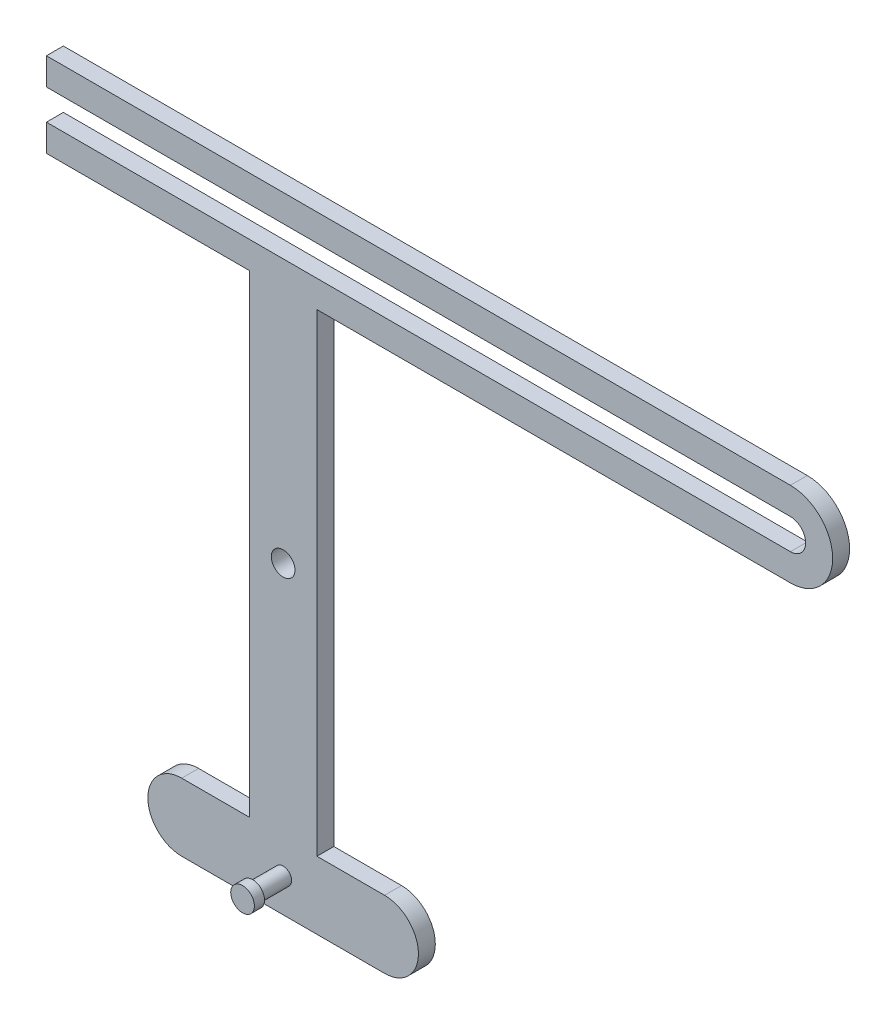
ISO-10303-21;
HEADER;
FILE_DESCRIPTION(('STEP AP214'),'2;1');
FILE_NAME('part.step','',(''),(''),'','','');
FILE_SCHEMA(('AUTOMOTIVE_DESIGN { 1 0 10303 214 1 1 1 1 }'));
ENDSEC;
DATA;
#1=APPLICATION_CONTEXT('core data for automotive mechanical design processes');
#2=APPLICATION_PROTOCOL_DEFINITION('international standard','automotive_design',2000,#1);
#3=PRODUCT_CONTEXT('',#1,'mechanical');
#4=PRODUCT('Part','Part','',(#3));
#5=PRODUCT_RELATED_PRODUCT_CATEGORY('part','',(#4));
#6=PRODUCT_DEFINITION_FORMATION('','',#4);
#7=PRODUCT_DEFINITION_CONTEXT('part definition',#1,'design');
#8=PRODUCT_DEFINITION('design','',#6,#7);
#9=PRODUCT_DEFINITION_SHAPE('','',#8);
#10=(LENGTH_UNIT() NAMED_UNIT(*) SI_UNIT(.MILLI.,.METRE.));
#11=(NAMED_UNIT(*) PLANE_ANGLE_UNIT() SI_UNIT($,.RADIAN.));
#12=(NAMED_UNIT(*) SI_UNIT($,.STERADIAN.) SOLID_ANGLE_UNIT());
#13=UNCERTAINTY_MEASURE_WITH_UNIT(LENGTH_MEASURE(1.E-05),#10,'distance_accuracy_value','');
#14=(GEOMETRIC_REPRESENTATION_CONTEXT(3) GLOBAL_UNCERTAINTY_ASSIGNED_CONTEXT((#13)) GLOBAL_UNIT_ASSIGNED_CONTEXT((#10,
#11,#12)) REPRESENTATION_CONTEXT('',''));
#15=CARTESIAN_POINT('',(0.,0.,0.));
#16=DIRECTION('',(0.,0.,1.));
#17=DIRECTION('',(1.,0.,0.));
#18=AXIS2_PLACEMENT_3D('',#15,#16,#17);
#19=CARTESIAN_POINT('',(0.,0.,18.415));
#20=DIRECTION('',(0.,0.,-1.));
#21=DIRECTION('',(-1.,0.,0.));
#22=AXIS2_PLACEMENT_3D('',#19,#20,#21);
#23=CYLINDRICAL_SURFACE('',#22,3.175);
#24=CARTESIAN_POINT('',(0.,0.,3.175));
#25=DIRECTION('',(0.,0.,1.));
#26=DIRECTION('',(1.,0.,0.));
#27=AXIS2_PLACEMENT_3D('',#24,#25,#26);
#28=CIRCLE('',#27,3.175);
#29=CARTESIAN_POINT('',(-3.175,0.,3.175));
#30=VERTEX_POINT('',#29);
#31=EDGE_CURVE('E379',#30,#30,#28,.T.);
#32=CARTESIAN_POINT('',(0.,0.,14.605));
#33=DIRECTION('',(0.,0.,1.));
#34=DIRECTION('',(1.,0.,0.));
#35=AXIS2_PLACEMENT_3D('',#32,#33,#34);
#36=CIRCLE('',#35,3.175);
#37=CARTESIAN_POINT('',(-3.175,0.,14.605));
#38=VERTEX_POINT('',#37);
#39=EDGE_CURVE('E11',#38,#38,#36,.T.);
#40=CARTESIAN_POINT('',(-3.175,0.,3.175));
#41=CARTESIAN_POINT('',(-3.175,0.,3.2940625));
#42=CARTESIAN_POINT('',(-3.175,0.,3.413125));
#43=CARTESIAN_POINT('',(-3.175,0.,3.65125));
#44=CARTESIAN_POINT('',(-3.175,0.,3.7703125));
#45=CARTESIAN_POINT('',(-3.175,0.,4.0084375));
#46=CARTESIAN_POINT('',(-3.175,0.,4.1275));
#47=CARTESIAN_POINT('',(-3.175,0.,4.365625));
#48=CARTESIAN_POINT('',(-3.175,0.,4.4846875));
#49=CARTESIAN_POINT('',(-3.175,0.,4.7228125));
#50=CARTESIAN_POINT('',(-3.175,0.,4.841875));
#51=CARTESIAN_POINT('',(-3.175,0.,5.08));
#52=CARTESIAN_POINT('',(-3.175,0.,5.1990625));
#53=CARTESIAN_POINT('',(-3.175,0.,5.4371875));
#54=CARTESIAN_POINT('',(-3.175,0.,5.55625));
#55=CARTESIAN_POINT('',(-3.175,0.,5.794375));
#56=CARTESIAN_POINT('',(-3.175,0.,5.9134375));
#57=CARTESIAN_POINT('',(-3.175,0.,6.1515625));
#58=CARTESIAN_POINT('',(-3.175,0.,6.270625));
#59=CARTESIAN_POINT('',(-3.175,0.,6.50875));
#60=CARTESIAN_POINT('',(-3.175,0.,6.6278125));
#61=CARTESIAN_POINT('',(-3.175,0.,6.8659375));
#62=CARTESIAN_POINT('',(-3.175,0.,6.985));
#63=CARTESIAN_POINT('',(-3.175,0.,7.223125));
#64=CARTESIAN_POINT('',(-3.175,0.,7.3421875));
#65=CARTESIAN_POINT('',(-3.175,0.,7.5803125));
#66=CARTESIAN_POINT('',(-3.175,0.,7.699375));
#67=CARTESIAN_POINT('',(-3.175,0.,7.9375));
#68=CARTESIAN_POINT('',(-3.175,0.,8.0565625));
#69=CARTESIAN_POINT('',(-3.175,0.,8.2946875));
#70=CARTESIAN_POINT('',(-3.175,0.,8.41375));
#71=CARTESIAN_POINT('',(-3.175,0.,8.651875));
#72=CARTESIAN_POINT('',(-3.175,0.,8.7709375));
#73=CARTESIAN_POINT('',(-3.175,0.,9.0090625));
#74=CARTESIAN_POINT('',(-3.175,0.,9.128125));
#75=CARTESIAN_POINT('',(-3.175,0.,9.36625));
#76=CARTESIAN_POINT('',(-3.175,0.,9.4853125));
#77=CARTESIAN_POINT('',(-3.175,0.,9.7234375));
#78=CARTESIAN_POINT('',(-3.175,0.,9.8425));
#79=CARTESIAN_POINT('',(-3.175,0.,10.080625));
#80=CARTESIAN_POINT('',(-3.175,0.,10.1996875));
#81=CARTESIAN_POINT('',(-3.175,0.,10.4378125));
#82=CARTESIAN_POINT('',(-3.175,0.,10.556875));
#83=CARTESIAN_POINT('',(-3.175,0.,10.795));
#84=CARTESIAN_POINT('',(-3.175,0.,10.9140625));
#85=CARTESIAN_POINT('',(-3.175,0.,11.1521875));
#86=CARTESIAN_POINT('',(-3.175,0.,11.27125));
#87=CARTESIAN_POINT('',(-3.175,0.,11.509375));
#88=CARTESIAN_POINT('',(-3.175,0.,11.6284375));
#89=CARTESIAN_POINT('',(-3.175,0.,11.8665625));
#90=CARTESIAN_POINT('',(-3.175,0.,11.985625));
#91=CARTESIAN_POINT('',(-3.175,0.,12.22375));
#92=CARTESIAN_POINT('',(-3.175,0.,12.3428125));
#93=CARTESIAN_POINT('',(-3.175,0.,12.5809375));
#94=CARTESIAN_POINT('',(-3.175,0.,12.7));
#95=CARTESIAN_POINT('',(-3.175,0.,12.938125));
#96=CARTESIAN_POINT('',(-3.175,0.,13.0571875));
#97=CARTESIAN_POINT('',(-3.175,0.,13.2953125));
#98=CARTESIAN_POINT('',(-3.175,0.,13.414375));
#99=CARTESIAN_POINT('',(-3.175,0.,13.6525));
#100=CARTESIAN_POINT('',(-3.175,0.,13.7715625));
#101=CARTESIAN_POINT('',(-3.175,0.,14.0096875));
#102=CARTESIAN_POINT('',(-3.175,0.,14.12875));
#103=CARTESIAN_POINT('',(-3.175,0.,14.366875));
#104=CARTESIAN_POINT('',(-3.175,0.,14.4859375));
#105=CARTESIAN_POINT('',(-3.175,0.,14.605));
#106=B_SPLINE_CURVE_WITH_KNOTS('',3,(#40,#41,#42,#43,#44,#45,#46,#47,#48,#49,#50,#51,#52,#53,
#54,#55,#56,#57,#58,#59,#60,#61,#62,#63,#64,#65,#66,#67,#68,#69,#70,#71,#72,#73,#74,#75,#76,#77,
#78,#79,#80,#81,#82,#83,#84,#85,#86,#87,#88,#89,#90,#91,#92,#93,#94,#95,#96,#97,#98,#99,#100,
#101,#102,#103,#104,#105),.UNSPECIFIED.,.F.,.F.,(4,2,2,2,2,2,2,2,2,2,2,2,2,2,2,2,2,2,2,2,2,2,2,
2,2,2,2,2,2,2,2,2,4),(0.,0.3571875,0.714375,1.0715625,1.42875,1.7859375,2.143125,2.5003125,
2.8575,3.2146875,3.571875,3.9290625,4.28625,4.6434375,5.000625,5.3578125,5.715,6.0721875,
6.429375,6.7865625,7.14375,7.5009375,7.858125,8.2153125,8.5725,8.9296875,9.286875,9.6440625,
10.00125,10.3584375,10.715625,11.0728125,11.43),.UNSPECIFIED.);
#107=EDGE_CURVE('BSEAM34',#30,#38,#106,.T.);
#108=ORIENTED_EDGE('',*,*,#31,.T.);
#109=ORIENTED_EDGE('',*,*,#39,.F.);
#110=ORIENTED_EDGE('',*,*,#107,.T.);
#111=ORIENTED_EDGE('',*,*,#107,.F.);
#112=EDGE_LOOP('',(#108,#110,#109,#111));
#113=FACE_BOUND('',#112,.T.);
#114=ADVANCED_FACE('F34',(#113),#23,.T.);
#115=CARTESIAN_POINT('',(-38.1,0.,3.175));
#116=DIRECTION('',(0.,0.,1.));
#117=DIRECTION('',(1.,0.,0.));
#118=AXIS2_PLACEMENT_3D('',#115,#116,#117);
#119=PLANE('',#118);
#120=DIRECTION('',(1.,0.,0.));
#121=VECTOR('',#120,1.);
#122=CARTESIAN_POINT('',(-88.9,200.66,3.175));
#123=LINE('',#122,#121);
#124=CARTESIAN_POINT('',(-88.9,200.66,3.175));
#125=VERTEX_POINT('',#124);
#126=CARTESIAN_POINT('',(190.5,200.66,3.175));
#127=VERTEX_POINT('',#126);
#128=EDGE_CURVE('E154',#125,#127,#123,.T.);
#129=ORIENTED_EDGE('',*,*,#128,.F.);
#130=DIRECTION('',(0.,-1.,0.));
#131=VECTOR('',#130,1.);
#132=CARTESIAN_POINT('',(-88.9,222.25,3.175));
#133=LINE('',#132,#131);
#134=CARTESIAN_POINT('',(-88.9,190.5,3.175));
#135=VERTEX_POINT('',#134);
#136=EDGE_CURVE('E192',#125,#135,#133,.T.);
#137=ORIENTED_EDGE('',*,*,#136,.T.);
#138=DIRECTION('',(1.,0.,0.));
#139=VECTOR('',#138,1.);
#140=CARTESIAN_POINT('',(-88.9,190.5,3.175));
#141=LINE('',#140,#139);
#142=CARTESIAN_POINT('',(-12.7,190.5,3.175));
#143=VERTEX_POINT('',#142);
#144=EDGE_CURVE('E193',#135,#143,#141,.T.);
#145=ORIENTED_EDGE('',*,*,#144,.T.);
#146=DIRECTION('',(0.,-1.,0.));
#147=VECTOR('',#146,1.);
#148=CARTESIAN_POINT('',(-12.7,12.7,3.175));
#149=LINE('',#148,#147);
#150=CARTESIAN_POINT('',(-12.7,12.7,3.175));
#151=VERTEX_POINT('',#150);
#152=EDGE_CURVE('E226',#143,#151,#149,.T.);
#153=ORIENTED_EDGE('',*,*,#152,.T.);
#154=DIRECTION('',(-1.,0.,0.));
#155=VECTOR('',#154,1.);
#156=CARTESIAN_POINT('',(-38.1,12.7,3.175));
#157=LINE('',#156,#155);
#158=CARTESIAN_POINT('',(-38.1,12.7,3.175));
#159=VERTEX_POINT('',#158);
#160=EDGE_CURVE('E57',#151,#159,#157,.T.);
#161=ORIENTED_EDGE('',*,*,#160,.T.);
#162=CARTESIAN_POINT('',(-38.1,0.,3.175));
#163=DIRECTION('',(0.,0.,1.));
#164=DIRECTION('',(1.,0.,0.));
#165=AXIS2_PLACEMENT_3D('',#162,#163,#164);
#166=CIRCLE('',#165,12.7);
#167=CARTESIAN_POINT('',(-38.1,-12.7,3.175));
#168=VERTEX_POINT('',#167);
#169=EDGE_CURVE('E244',#159,#168,#166,.T.);
#170=ORIENTED_EDGE('',*,*,#169,.T.);
#171=DIRECTION('',(1.,0.,0.));
#172=VECTOR('',#171,1.);
#173=CARTESIAN_POINT('',(-38.1,-12.7,3.175));
#174=LINE('',#173,#172);
#175=CARTESIAN_POINT('',(38.1,-12.7,3.175));
#176=VERTEX_POINT('',#175);
#177=EDGE_CURVE('E247',#168,#176,#174,.T.);
#178=ORIENTED_EDGE('',*,*,#177,.T.);
#179=CARTESIAN_POINT('',(38.1,0.,3.175));
#180=DIRECTION('',(0.,0.,1.));
#181=DIRECTION('',(1.,0.,0.));
#182=AXIS2_PLACEMENT_3D('',#179,#180,#181);
#183=CIRCLE('',#182,12.7);
#184=CARTESIAN_POINT('',(38.1,12.7,3.175));
#185=VERTEX_POINT('',#184);
#186=EDGE_CURVE('E250',#176,#185,#183,.T.);
#187=ORIENTED_EDGE('',*,*,#186,.T.);
#188=CARTESIAN_POINT('',(12.7,12.7,3.175));
#189=VERTEX_POINT('',#188);
#190=EDGE_CURVE('E252',#185,#189,#157,.T.);
#191=ORIENTED_EDGE('',*,*,#190,.T.);
#192=DIRECTION('',(0.,1.,0.));
#193=VECTOR('',#192,1.);
#194=CARTESIAN_POINT('',(12.7,12.7,3.175));
#195=LINE('',#194,#193);
#196=CARTESIAN_POINT('',(12.7,190.5,3.175));
#197=VERTEX_POINT('',#196);
#198=EDGE_CURVE('E223',#189,#197,#195,.T.);
#199=ORIENTED_EDGE('',*,*,#198,.T.);
#200=CARTESIAN_POINT('',(190.5,190.5,3.175));
#201=VERTEX_POINT('',#200);
#202=EDGE_CURVE('E191',#197,#201,#141,.T.);
#203=ORIENTED_EDGE('',*,*,#202,.T.);
#204=CARTESIAN_POINT('',(190.5,206.375,3.175));
#205=DIRECTION('',(0.,0.,1.));
#206=DIRECTION('',(1.,0.,0.));
#207=AXIS2_PLACEMENT_3D('',#204,#205,#206);
#208=CIRCLE('',#207,15.875);
#209=CARTESIAN_POINT('',(190.5,222.25,3.175));
#210=VERTEX_POINT('',#209);
#211=EDGE_CURVE('E196',#201,#210,#208,.T.);
#212=ORIENTED_EDGE('',*,*,#211,.T.);
#213=DIRECTION('',(-1.,0.,0.));
#214=VECTOR('',#213,1.);
#215=CARTESIAN_POINT('',(-88.9,222.25,3.175));
#216=LINE('',#215,#214);
#217=CARTESIAN_POINT('',(-88.9,222.25,3.175));
#218=VERTEX_POINT('',#217);
#219=EDGE_CURVE('E198',#210,#218,#216,.T.);
#220=ORIENTED_EDGE('',*,*,#219,.T.);
#221=CARTESIAN_POINT('',(-88.9,212.09,3.175));
#222=VERTEX_POINT('',#221);
#223=EDGE_CURVE('E188',#218,#222,#133,.T.);
#224=ORIENTED_EDGE('',*,*,#223,.T.);
#225=DIRECTION('',(-1.,0.,0.));
#226=VECTOR('',#225,1.);
#227=CARTESIAN_POINT('',(190.5,212.09,3.175));
#228=LINE('',#227,#226);
#229=CARTESIAN_POINT('',(190.5,212.09,3.175));
#230=VERTEX_POINT('',#229);
#231=EDGE_CURVE('E49',#230,#222,#228,.T.);
#232=ORIENTED_EDGE('',*,*,#231,.F.);
#233=CARTESIAN_POINT('',(190.5,206.375,3.175));
#234=DIRECTION('',(0.,0.,1.));
#235=DIRECTION('',(1.,0.,0.));
#236=AXIS2_PLACEMENT_3D('',#233,#234,#235);
#237=CIRCLE('',#236,5.71500000000004);
#238=EDGE_CURVE('E173',#127,#230,#237,.T.);
#239=ORIENTED_EDGE('',*,*,#238,.F.);
#240=EDGE_LOOP('',(#129,#137,#145,#153,#161,#170,#178,#187,#191,#199,#203,#212,#220,#224,#232,#239));
#241=FACE_BOUND('',#240,.T.);
#242=CARTESIAN_POINT('',(0.,101.6,3.175));
#243=DIRECTION('',(0.,0.,1.));
#244=DIRECTION('',(1.,0.,0.));
#245=AXIS2_PLACEMENT_3D('',#242,#243,#244);
#246=CIRCLE('',#245,4.445);
#247=CARTESIAN_POINT('',(4.445,101.6,3.175));
#248=VERTEX_POINT('',#247);
#249=EDGE_CURVE('E176',#248,#248,#246,.T.);
#250=ORIENTED_EDGE('',*,*,#249,.F.);
#251=EDGE_LOOP('',(#250));
#252=FACE_BOUND('',#251,.T.);
#253=ORIENTED_EDGE('',*,*,#31,.F.);
#254=EDGE_LOOP('',(#253));
#255=FACE_BOUND('',#254,.T.);
#256=ADVANCED_FACE('F292',(#241,#252,#255),#119,.T.);
#257=CARTESIAN_POINT('',(-88.9,222.25,3.175));
#258=DIRECTION('',(1.,0.,0.));
#259=DIRECTION('',(0.,0.,-1.));
#260=AXIS2_PLACEMENT_3D('',#257,#258,#259);
#261=PLANE('',#260);
#262=ORIENTED_EDGE('',*,*,#136,.F.);
#263=DIRECTION('',(0.,0.,1.));
#264=VECTOR('',#263,1.);
#265=CARTESIAN_POINT('',(-88.9,200.66,-3.175));
#266=LINE('',#265,#264);
#267=CARTESIAN_POINT('',(-88.9,200.66,-3.175));
#268=VERTEX_POINT('',#267);
#269=EDGE_CURVE('E183',#268,#125,#266,.T.);
#270=ORIENTED_EDGE('',*,*,#269,.F.);
#271=DIRECTION('',(0.,-1.,0.));
#272=VECTOR('',#271,1.);
#273=CARTESIAN_POINT('',(-88.9,222.25,-3.175));
#274=LINE('',#273,#272);
#275=CARTESIAN_POINT('',(-88.9,190.5,-3.175));
#276=VERTEX_POINT('',#275);
#277=EDGE_CURVE('E171',#268,#276,#274,.T.);
#278=ORIENTED_EDGE('',*,*,#277,.T.);
#279=DIRECTION('',(0.,0.,-1.));
#280=VECTOR('',#279,1.);
#281=CARTESIAN_POINT('',(-88.9,190.5,3.175));
#282=LINE('',#281,#280);
#283=EDGE_CURVE('E219',#135,#276,#282,.T.);
#284=ORIENTED_EDGE('',*,*,#283,.F.);
#285=EDGE_LOOP('',(#262,#270,#278,#284));
#286=FACE_BOUND('',#285,.T.);
#287=ADVANCED_FACE('F320',(#286),#261,.F.);
#288=CARTESIAN_POINT('',(-38.1,12.7,3.175));
#289=DIRECTION('',(0.,-1.,0.));
#290=DIRECTION('',(1.,0.,0.));
#291=AXIS2_PLACEMENT_3D('',#288,#289,#290);
#292=PLANE('',#291);
#293=DIRECTION('',(0.,0.,-1.));
#294=VECTOR('',#293,1.);
#295=CARTESIAN_POINT('',(12.7,12.7,3.175));
#296=LINE('',#295,#294);
#297=CARTESIAN_POINT('',(12.7,12.7,-3.175));
#298=VERTEX_POINT('',#297);
#299=EDGE_CURVE('E229',#189,#298,#296,.T.);
#300=ORIENTED_EDGE('',*,*,#299,.F.);
#301=ORIENTED_EDGE('',*,*,#190,.F.);
#302=DIRECTION('',(0.,0.,-1.));
#303=VECTOR('',#302,1.);
#304=CARTESIAN_POINT('',(38.1,12.7,3.175));
#305=LINE('',#304,#303);
#306=CARTESIAN_POINT('',(38.1,12.7,-3.175));
#307=VERTEX_POINT('',#306);
#308=EDGE_CURVE('E266',#185,#307,#305,.T.);
#309=ORIENTED_EDGE('',*,*,#308,.T.);
#310=DIRECTION('',(-1.,0.,0.));
#311=VECTOR('',#310,1.);
#312=CARTESIAN_POINT('',(-38.1,12.7,-3.175));
#313=LINE('',#312,#311);
#314=EDGE_CURVE('E248',#307,#298,#313,.T.);
#315=ORIENTED_EDGE('',*,*,#314,.T.);
#316=EDGE_LOOP('',(#300,#301,#309,#315));
#317=FACE_BOUND('',#316,.T.);
#318=ADVANCED_FACE('F289',(#317),#292,.F.);
#319=DIRECTION('',(0.,0.,-1.));
#320=VECTOR('',#319,1.);
#321=CARTESIAN_POINT('',(-12.7,12.7,3.175));
#322=LINE('',#321,#320);
#323=CARTESIAN_POINT('',(-12.7,12.7,-3.175));
#324=VERTEX_POINT('',#323);
#325=EDGE_CURVE('E236',#151,#324,#322,.T.);
#326=ORIENTED_EDGE('',*,*,#325,.T.);
#327=CARTESIAN_POINT('',(-38.1,12.7,-3.175));
#328=VERTEX_POINT('',#327);
#329=EDGE_CURVE('E262',#324,#328,#313,.T.);
#330=ORIENTED_EDGE('',*,*,#329,.T.);
#331=DIRECTION('',(0.,0.,-1.));
#332=VECTOR('',#331,1.);
#333=CARTESIAN_POINT('',(-38.1,12.7,3.175));
#334=LINE('',#333,#332);
#335=EDGE_CURVE('E255',#159,#328,#334,.T.);
#336=ORIENTED_EDGE('',*,*,#335,.F.);
#337=ORIENTED_EDGE('',*,*,#160,.F.);
#338=EDGE_LOOP('',(#326,#330,#336,#337));
#339=FACE_BOUND('',#338,.T.);
#340=ADVANCED_FACE('F327',(#339),#292,.F.);
#341=CARTESIAN_POINT('',(-38.1,0.,3.175));
#342=DIRECTION('',(0.,0.,-1.));
#343=DIRECTION('',(-1.,0.,0.));
#344=AXIS2_PLACEMENT_3D('',#341,#342,#343);
#345=CYLINDRICAL_SURFACE('',#344,12.7);
#346=CARTESIAN_POINT('',(-38.1,0.,-3.175));
#347=DIRECTION('',(0.,0.,1.));
#348=DIRECTION('',(1.,0.,0.));
#349=AXIS2_PLACEMENT_3D('',#346,#347,#348);
#350=CIRCLE('',#349,12.7);
#351=CARTESIAN_POINT('',(-38.1,-12.7,-3.175));
#352=VERTEX_POINT('',#351);
#353=EDGE_CURVE('E243',#328,#352,#350,.T.);
#354=ORIENTED_EDGE('',*,*,#353,.T.);
#355=DIRECTION('',(0.,0.,-1.));
#356=VECTOR('',#355,1.);
#357=CARTESIAN_POINT('',(-38.1,-12.7,3.175));
#358=LINE('',#357,#356);
#359=EDGE_CURVE('E42',#168,#352,#358,.T.);
#360=ORIENTED_EDGE('',*,*,#359,.F.);
#361=ORIENTED_EDGE('',*,*,#169,.F.);
#362=ORIENTED_EDGE('',*,*,#335,.T.);
#363=EDGE_LOOP('',(#354,#360,#361,#362));
#364=FACE_BOUND('',#363,.T.);
#365=ADVANCED_FACE('F36',(#364),#345,.T.);
#366=CARTESIAN_POINT('',(-38.1,-12.7,3.175));
#367=DIRECTION('',(0.,1.,0.));
#368=DIRECTION('',(-1.,0.,0.));
#369=AXIS2_PLACEMENT_3D('',#366,#367,#368);
#370=PLANE('',#369);
#371=DIRECTION('',(1.,0.,0.));
#372=VECTOR('',#371,1.);
#373=CARTESIAN_POINT('',(-38.1,-12.7,-3.175));
#374=LINE('',#373,#372);
#375=CARTESIAN_POINT('',(38.1,-12.7,-3.175));
#376=VERTEX_POINT('',#375);
#377=EDGE_CURVE('E258',#352,#376,#374,.T.);
#378=ORIENTED_EDGE('',*,*,#377,.T.);
#379=DIRECTION('',(0.,0.,-1.));
#380=VECTOR('',#379,1.);
#381=CARTESIAN_POINT('',(38.1,-12.7,3.175));
#382=LINE('',#381,#380);
#383=EDGE_CURVE('E269',#176,#376,#382,.T.);
#384=ORIENTED_EDGE('',*,*,#383,.F.);
#385=ORIENTED_EDGE('',*,*,#177,.F.);
#386=ORIENTED_EDGE('',*,*,#359,.T.);
#387=EDGE_LOOP('',(#378,#384,#385,#386));
#388=FACE_BOUND('',#387,.T.);
#389=ADVANCED_FACE('F274',(#388),#370,.F.);
#390=CARTESIAN_POINT('',(38.1,0.,3.175));
#391=DIRECTION('',(0.,0.,-1.));
#392=DIRECTION('',(-1.,0.,0.));
#393=AXIS2_PLACEMENT_3D('',#390,#391,#392);
#394=CYLINDRICAL_SURFACE('',#393,12.7);
#395=CARTESIAN_POINT('',(38.1,0.,-3.175));
#396=DIRECTION('',(0.,0.,1.));
#397=DIRECTION('',(1.,0.,0.));
#398=AXIS2_PLACEMENT_3D('',#395,#396,#397);
#399=CIRCLE('',#398,12.7);
#400=EDGE_CURVE('E260',#376,#307,#399,.T.);
#401=ORIENTED_EDGE('',*,*,#400,.T.);
#402=ORIENTED_EDGE('',*,*,#308,.F.);
#403=ORIENTED_EDGE('',*,*,#186,.F.);
#404=ORIENTED_EDGE('',*,*,#383,.T.);
#405=EDGE_LOOP('',(#401,#402,#403,#404));
#406=FACE_BOUND('',#405,.T.);
#407=ADVANCED_FACE('F285',(#406),#394,.T.);
#408=CARTESIAN_POINT('',(-38.1,0.,-3.175));
#409=DIRECTION('',(0.,0.,1.));
#410=DIRECTION('',(1.,0.,0.));
#411=AXIS2_PLACEMENT_3D('',#408,#409,#410);
#412=PLANE('',#411);
#413=CARTESIAN_POINT('',(0.,101.6,-3.175));
#414=DIRECTION('',(0.,0.,1.));
#415=DIRECTION('',(1.,0.,0.));
#416=AXIS2_PLACEMENT_3D('',#413,#414,#415);
#417=CIRCLE('',#416,4.445);
#418=CARTESIAN_POINT('',(4.445,101.6,-3.175));
#419=VERTEX_POINT('',#418);
#420=EDGE_CURVE('E181',#419,#419,#417,.T.);
#421=ORIENTED_EDGE('',*,*,#420,.T.);
#422=EDGE_LOOP('',(#421));
#423=FACE_BOUND('',#422,.T.);
#424=ORIENTED_EDGE('',*,*,#277,.F.);
#425=DIRECTION('',(1.,0.,0.));
#426=VECTOR('',#425,1.);
#427=CARTESIAN_POINT('',(-88.9,200.66,-3.175));
#428=LINE('',#427,#426);
#429=CARTESIAN_POINT('',(190.5,200.66,-3.175));
#430=VERTEX_POINT('',#429);
#431=EDGE_CURVE('E151',#268,#430,#428,.T.);
#432=ORIENTED_EDGE('',*,*,#431,.T.);
#433=CARTESIAN_POINT('',(190.5,206.375,-3.175));
#434=DIRECTION('',(0.,0.,1.));
#435=DIRECTION('',(1.,0.,0.));
#436=AXIS2_PLACEMENT_3D('',#433,#434,#435);
#437=CIRCLE('',#436,5.71500000000004);
#438=CARTESIAN_POINT('',(190.5,212.09,-3.175));
#439=VERTEX_POINT('',#438);
#440=EDGE_CURVE('E162',#430,#439,#437,.T.);
#441=ORIENTED_EDGE('',*,*,#440,.T.);
#442=DIRECTION('',(-1.,0.,0.));
#443=VECTOR('',#442,1.);
#444=CARTESIAN_POINT('',(190.5,212.09,-3.175));
#445=LINE('',#444,#443);
#446=CARTESIAN_POINT('',(-88.9,212.09,-3.175));
#447=VERTEX_POINT('',#446);
#448=EDGE_CURVE('E159',#439,#447,#445,.T.);
#449=ORIENTED_EDGE('',*,*,#448,.T.);
#450=CARTESIAN_POINT('',(-88.9,222.25,-3.175));
#451=VERTEX_POINT('',#450);
#452=EDGE_CURVE('E201',#451,#447,#274,.T.);
#453=ORIENTED_EDGE('',*,*,#452,.F.);
#454=DIRECTION('',(-1.,0.,0.));
#455=VECTOR('',#454,1.);
#456=CARTESIAN_POINT('',(-88.9,222.25,-3.175));
#457=LINE('',#456,#455);
#458=CARTESIAN_POINT('',(190.5,222.25,-3.175));
#459=VERTEX_POINT('',#458);
#460=EDGE_CURVE('E209',#459,#451,#457,.T.);
#461=ORIENTED_EDGE('',*,*,#460,.F.);
#462=CARTESIAN_POINT('',(190.5,206.375,-3.175));
#463=DIRECTION('',(0.,0.,1.));
#464=DIRECTION('',(1.,0.,0.));
#465=AXIS2_PLACEMENT_3D('',#462,#463,#464);
#466=CIRCLE('',#465,15.875);
#467=CARTESIAN_POINT('',(190.5,190.5,-3.175));
#468=VERTEX_POINT('',#467);
#469=EDGE_CURVE('E207',#468,#459,#466,.T.);
#470=ORIENTED_EDGE('',*,*,#469,.F.);
#471=DIRECTION('',(1.,0.,0.));
#472=VECTOR('',#471,1.);
#473=CARTESIAN_POINT('',(-88.9,190.5,-3.175));
#474=LINE('',#473,#472);
#475=CARTESIAN_POINT('',(12.7,190.5,-3.175));
#476=VERTEX_POINT('',#475);
#477=EDGE_CURVE('E204',#476,#468,#474,.T.);
#478=ORIENTED_EDGE('',*,*,#477,.F.);
#479=DIRECTION('',(0.,1.,0.));
#480=VECTOR('',#479,1.);
#481=CARTESIAN_POINT('',(12.7,12.7,-3.175));
#482=LINE('',#481,#480);
#483=EDGE_CURVE('E222',#298,#476,#482,.T.);
#484=ORIENTED_EDGE('',*,*,#483,.F.);
#485=ORIENTED_EDGE('',*,*,#314,.F.);
#486=ORIENTED_EDGE('',*,*,#400,.F.);
#487=ORIENTED_EDGE('',*,*,#377,.F.);
#488=ORIENTED_EDGE('',*,*,#353,.F.);
#489=ORIENTED_EDGE('',*,*,#329,.F.);
#490=DIRECTION('',(0.,-1.,0.));
#491=VECTOR('',#490,1.);
#492=CARTESIAN_POINT('',(-12.7,12.7,-3.175));
#493=LINE('',#492,#491);
#494=CARTESIAN_POINT('',(-12.7,190.5,-3.175));
#495=VERTEX_POINT('',#494);
#496=EDGE_CURVE('E227',#495,#324,#493,.T.);
#497=ORIENTED_EDGE('',*,*,#496,.F.);
#498=EDGE_CURVE('E205',#276,#495,#474,.T.);
#499=ORIENTED_EDGE('',*,*,#498,.F.);
#500=EDGE_LOOP('',(#424,#432,#441,#449,#453,#461,#470,#478,#484,#485,#486,#487,#488,#489,#497,#499));
#501=FACE_BOUND('',#500,.T.);
#502=ADVANCED_FACE('F169',(#423,#501),#412,.F.);
#503=CARTESIAN_POINT('',(12.7,12.7,3.175));
#504=DIRECTION('',(-1.,0.,0.));
#505=DIRECTION('',(0.,0.,1.));
#506=AXIS2_PLACEMENT_3D('',#503,#504,#505);
#507=PLANE('',#506);
#508=ORIENTED_EDGE('',*,*,#483,.T.);
#509=DIRECTION('',(0.,0.,-1.));
#510=VECTOR('',#509,1.);
#511=CARTESIAN_POINT('',(12.7,190.5,3.175));
#512=LINE('',#511,#510);
#513=EDGE_CURVE('E241',#197,#476,#512,.T.);
#514=ORIENTED_EDGE('',*,*,#513,.F.);
#515=ORIENTED_EDGE('',*,*,#198,.F.);
#516=ORIENTED_EDGE('',*,*,#299,.T.);
#517=EDGE_LOOP('',(#508,#514,#515,#516));
#518=FACE_BOUND('',#517,.T.);
#519=ADVANCED_FACE('F296',(#518),#507,.F.);
#520=CARTESIAN_POINT('',(-12.7,12.7,3.175));
#521=DIRECTION('',(1.,0.,0.));
#522=DIRECTION('',(0.,0.,-1.));
#523=AXIS2_PLACEMENT_3D('',#520,#521,#522);
#524=PLANE('',#523);
#525=ORIENTED_EDGE('',*,*,#496,.T.);
#526=ORIENTED_EDGE('',*,*,#325,.F.);
#527=ORIENTED_EDGE('',*,*,#152,.F.);
#528=DIRECTION('',(0.,0.,-1.));
#529=VECTOR('',#528,1.);
#530=CARTESIAN_POINT('',(-12.7,190.5,3.175));
#531=LINE('',#530,#529);
#532=EDGE_CURVE('E238',#143,#495,#531,.T.);
#533=ORIENTED_EDGE('',*,*,#532,.T.);
#534=EDGE_LOOP('',(#525,#526,#527,#533));
#535=FACE_BOUND('',#534,.T.);
#536=ADVANCED_FACE('F326',(#535),#524,.F.);
#537=CARTESIAN_POINT('',(-88.9,190.5,3.175));
#538=DIRECTION('',(0.,1.,0.));
#539=DIRECTION('',(-1.,0.,0.));
#540=AXIS2_PLACEMENT_3D('',#537,#538,#539);
#541=PLANE('',#540);
#542=ORIENTED_EDGE('',*,*,#202,.F.);
#543=ORIENTED_EDGE('',*,*,#513,.T.);
#544=ORIENTED_EDGE('',*,*,#477,.T.);
#545=DIRECTION('',(0.,0.,-1.));
#546=VECTOR('',#545,1.);
#547=CARTESIAN_POINT('',(190.5,190.5,3.175));
#548=LINE('',#547,#546);
#549=EDGE_CURVE('E216',#201,#468,#548,.T.);
#550=ORIENTED_EDGE('',*,*,#549,.F.);
#551=EDGE_LOOP('',(#542,#543,#544,#550));
#552=FACE_BOUND('',#551,.T.);
#553=ADVANCED_FACE('F299',(#552),#541,.F.);
#554=ORIENTED_EDGE('',*,*,#498,.T.);
#555=ORIENTED_EDGE('',*,*,#532,.F.);
#556=ORIENTED_EDGE('',*,*,#144,.F.);
#557=ORIENTED_EDGE('',*,*,#283,.T.);
#558=EDGE_LOOP('',(#554,#555,#556,#557));
#559=FACE_BOUND('',#558,.T.);
#560=ADVANCED_FACE('F322',(#559),#541,.F.);
#561=ORIENTED_EDGE('',*,*,#452,.T.);
#562=DIRECTION('',(0.,0.,1.));
#563=VECTOR('',#562,1.);
#564=CARTESIAN_POINT('',(-88.9,212.09,-3.175));
#565=LINE('',#564,#563);
#566=EDGE_CURVE('E185',#447,#222,#565,.T.);
#567=ORIENTED_EDGE('',*,*,#566,.T.);
#568=ORIENTED_EDGE('',*,*,#223,.F.);
#569=DIRECTION('',(0.,0.,-1.));
#570=VECTOR('',#569,1.);
#571=CARTESIAN_POINT('',(-88.9,222.25,3.175));
#572=LINE('',#571,#570);
#573=EDGE_CURVE('E200',#218,#451,#572,.T.);
#574=ORIENTED_EDGE('',*,*,#573,.T.);
#575=EDGE_LOOP('',(#561,#567,#568,#574));
#576=FACE_BOUND('',#575,.T.);
#577=ADVANCED_FACE('F314',(#576),#261,.F.);
#578=CARTESIAN_POINT('',(190.5,206.375,3.175));
#579=DIRECTION('',(0.,0.,-1.));
#580=DIRECTION('',(-1.,0.,0.));
#581=AXIS2_PLACEMENT_3D('',#578,#579,#580);
#582=CYLINDRICAL_SURFACE('',#581,15.875);
#583=ORIENTED_EDGE('',*,*,#469,.T.);
#584=DIRECTION('',(0.,0.,-1.));
#585=VECTOR('',#584,1.);
#586=CARTESIAN_POINT('',(190.5,222.25,3.175));
#587=LINE('',#586,#585);
#588=EDGE_CURVE('E213',#210,#459,#587,.T.);
#589=ORIENTED_EDGE('',*,*,#588,.F.);
#590=ORIENTED_EDGE('',*,*,#211,.F.);
#591=ORIENTED_EDGE('',*,*,#549,.T.);
#592=EDGE_LOOP('',(#583,#589,#590,#591));
#593=FACE_BOUND('',#592,.T.);
#594=ADVANCED_FACE('F306',(#593),#582,.T.);
#595=CARTESIAN_POINT('',(-88.9,222.25,3.175));
#596=DIRECTION('',(0.,-1.,0.));
#597=DIRECTION('',(1.,0.,0.));
#598=AXIS2_PLACEMENT_3D('',#595,#596,#597);
#599=PLANE('',#598);
#600=ORIENTED_EDGE('',*,*,#460,.T.);
#601=ORIENTED_EDGE('',*,*,#573,.F.);
#602=ORIENTED_EDGE('',*,*,#219,.F.);
#603=ORIENTED_EDGE('',*,*,#588,.T.);
#604=EDGE_LOOP('',(#600,#601,#602,#603));
#605=FACE_BOUND('',#604,.T.);
#606=ADVANCED_FACE('F310',(#605),#599,.F.);
#607=CARTESIAN_POINT('',(-88.9,200.66,-3.175));
#608=DIRECTION('',(0.,-1.,0.));
#609=DIRECTION('',(1.,0.,0.));
#610=AXIS2_PLACEMENT_3D('',#607,#608,#609);
#611=PLANE('',#610);
#612=ORIENTED_EDGE('',*,*,#128,.T.);
#613=DIRECTION('',(0.,0.,1.));
#614=VECTOR('',#613,1.);
#615=CARTESIAN_POINT('',(190.5,200.66,-3.175));
#616=LINE('',#615,#614);
#617=EDGE_CURVE('E147',#430,#127,#616,.T.);
#618=ORIENTED_EDGE('',*,*,#617,.F.);
#619=ORIENTED_EDGE('',*,*,#431,.F.);
#620=ORIENTED_EDGE('',*,*,#269,.T.);
#621=EDGE_LOOP('',(#612,#618,#619,#620));
#622=FACE_BOUND('',#621,.T.);
#623=ADVANCED_FACE('F149',(#622),#611,.F.);
#624=CARTESIAN_POINT('',(190.5,212.09,-3.175));
#625=DIRECTION('',(0.,1.,0.));
#626=DIRECTION('',(-1.,0.,0.));
#627=AXIS2_PLACEMENT_3D('',#624,#625,#626);
#628=PLANE('',#627);
#629=ORIENTED_EDGE('',*,*,#231,.T.);
#630=ORIENTED_EDGE('',*,*,#566,.F.);
#631=ORIENTED_EDGE('',*,*,#448,.F.);
#632=DIRECTION('',(0.,0.,1.));
#633=VECTOR('',#632,1.);
#634=CARTESIAN_POINT('',(190.5,212.09,-3.175));
#635=LINE('',#634,#633);
#636=EDGE_CURVE('E158',#439,#230,#635,.T.);
#637=ORIENTED_EDGE('',*,*,#636,.T.);
#638=EDGE_LOOP('',(#629,#630,#631,#637));
#639=FACE_BOUND('',#638,.T.);
#640=ADVANCED_FACE('F315',(#639),#628,.F.);
#641=CARTESIAN_POINT('',(190.5,206.375,-3.175));
#642=DIRECTION('',(0.,0.,1.));
#643=DIRECTION('',(1.,0.,0.));
#644=AXIS2_PLACEMENT_3D('',#641,#642,#643);
#645=CYLINDRICAL_SURFACE('',#644,5.71500000000004);
#646=ORIENTED_EDGE('',*,*,#238,.T.);
#647=ORIENTED_EDGE('',*,*,#636,.F.);
#648=ORIENTED_EDGE('',*,*,#440,.F.);
#649=ORIENTED_EDGE('',*,*,#617,.T.);
#650=EDGE_LOOP('',(#646,#647,#648,#649));
#651=FACE_BOUND('',#650,.T.);
#652=ADVANCED_FACE('F163',(#651),#645,.F.);
#653=CARTESIAN_POINT('',(0.,101.6,-3.175));
#654=DIRECTION('',(0.,0.,1.));
#655=DIRECTION('',(1.,0.,0.));
#656=AXIS2_PLACEMENT_3D('',#653,#654,#655);
#657=CYLINDRICAL_SURFACE('',#656,4.445);
#658=ORIENTED_EDGE('',*,*,#420,.F.);
#659=EDGE_LOOP('',(#658));
#660=FACE_BOUND('',#659,.T.);
#661=ORIENTED_EDGE('',*,*,#249,.T.);
#662=EDGE_LOOP('',(#661));
#663=FACE_BOUND('',#662,.T.);
#664=ADVANCED_FACE('F349',(#660,#663),#657,.F.);
#665=CARTESIAN_POINT('',(0.,0.,14.605));
#666=DIRECTION('',(0.,0.,1.));
#667=DIRECTION('',(1.,0.,0.));
#668=AXIS2_PLACEMENT_3D('',#665,#666,#667);
#669=PLANE('',#668);
#670=CARTESIAN_POINT('',(0.,0.,14.605));
#671=DIRECTION('',(0.,0.,1.));
#672=DIRECTION('',(1.,0.,0.));
#673=AXIS2_PLACEMENT_3D('',#670,#671,#672);
#674=CIRCLE('',#673,4.445);
#675=CARTESIAN_POINT('',(4.445,0.,14.605));
#676=VERTEX_POINT('',#675);
#677=EDGE_CURVE('E382',#676,#676,#674,.T.);
#678=ORIENTED_EDGE('',*,*,#677,.F.);
#679=EDGE_LOOP('',(#678));
#680=FACE_BOUND('',#679,.T.);
#681=ORIENTED_EDGE('',*,*,#39,.T.);
#682=EDGE_LOOP('',(#681));
#683=FACE_BOUND('',#682,.T.);
#684=ADVANCED_FACE('F352',(#680,#683),#669,.F.);
#685=CARTESIAN_POINT('',(0.,0.,14.605));
#686=DIRECTION('',(0.,0.,1.));
#687=DIRECTION('',(1.,0.,0.));
#688=AXIS2_PLACEMENT_3D('',#685,#686,#687);
#689=CYLINDRICAL_SURFACE('',#688,4.445);
#690=CARTESIAN_POINT('',(0.,0.,18.415));
#691=DIRECTION('',(0.,0.,1.));
#692=DIRECTION('',(1.,0.,0.));
#693=AXIS2_PLACEMENT_3D('',#690,#691,#692);
#694=CIRCLE('',#693,4.445);
#695=CARTESIAN_POINT('',(4.445,0.,18.415));
#696=VERTEX_POINT('',#695);
#697=EDGE_CURVE('E383',#696,#696,#694,.T.);
#698=CARTESIAN_POINT('',(4.445,0.,14.605));
#699=CARTESIAN_POINT('',(4.445,0.,14.6446875));
#700=CARTESIAN_POINT('',(4.445,0.,14.684375));
#701=CARTESIAN_POINT('',(4.445,0.,14.76375));
#702=CARTESIAN_POINT('',(4.445,0.,14.8034375));
#703=CARTESIAN_POINT('',(4.445,0.,14.8828125));
#704=CARTESIAN_POINT('',(4.445,0.,14.9225));
#705=CARTESIAN_POINT('',(4.445,0.,15.001875));
#706=CARTESIAN_POINT('',(4.445,0.,15.0415625));
#707=CARTESIAN_POINT('',(4.445,0.,15.1209375));
#708=CARTESIAN_POINT('',(4.445,0.,15.160625));
#709=CARTESIAN_POINT('',(4.445,0.,15.24));
#710=CARTESIAN_POINT('',(4.445,0.,15.2796875));
#711=CARTESIAN_POINT('',(4.445,0.,15.3590625));
#712=CARTESIAN_POINT('',(4.445,0.,15.39875));
#713=CARTESIAN_POINT('',(4.445,0.,15.478125));
#714=CARTESIAN_POINT('',(4.445,0.,15.5178125));
#715=CARTESIAN_POINT('',(4.445,0.,15.5971875));
#716=CARTESIAN_POINT('',(4.445,0.,15.636875));
#717=CARTESIAN_POINT('',(4.445,0.,15.71625));
#718=CARTESIAN_POINT('',(4.445,0.,15.7559375));
#719=CARTESIAN_POINT('',(4.445,0.,15.8353125));
#720=CARTESIAN_POINT('',(4.445,0.,15.875));
#721=CARTESIAN_POINT('',(4.445,0.,15.954375));
#722=CARTESIAN_POINT('',(4.445,0.,15.9940625));
#723=CARTESIAN_POINT('',(4.445,0.,16.0734375));
#724=CARTESIAN_POINT('',(4.445,0.,16.113125));
#725=CARTESIAN_POINT('',(4.445,0.,16.1925));
#726=CARTESIAN_POINT('',(4.445,0.,16.2321875));
#727=CARTESIAN_POINT('',(4.445,0.,16.3115625));
#728=CARTESIAN_POINT('',(4.445,0.,16.35125));
#729=CARTESIAN_POINT('',(4.445,0.,16.430625));
#730=CARTESIAN_POINT('',(4.445,0.,16.4703125));
#731=CARTESIAN_POINT('',(4.445,0.,16.5496875));
#732=CARTESIAN_POINT('',(4.445,0.,16.589375));
#733=CARTESIAN_POINT('',(4.445,0.,16.66875));
#734=CARTESIAN_POINT('',(4.445,0.,16.7084375));
#735=CARTESIAN_POINT('',(4.445,0.,16.7878125));
#736=CARTESIAN_POINT('',(4.445,0.,16.8275));
#737=CARTESIAN_POINT('',(4.445,0.,16.906875));
#738=CARTESIAN_POINT('',(4.445,0.,16.9465625));
#739=CARTESIAN_POINT('',(4.445,0.,17.0259375));
#740=CARTESIAN_POINT('',(4.445,0.,17.065625));
#741=CARTESIAN_POINT('',(4.445,0.,17.145));
#742=CARTESIAN_POINT('',(4.445,0.,17.1846875));
#743=CARTESIAN_POINT('',(4.445,0.,17.2640625));
#744=CARTESIAN_POINT('',(4.445,0.,17.30375));
#745=CARTESIAN_POINT('',(4.445,0.,17.383125));
#746=CARTESIAN_POINT('',(4.445,0.,17.4228125));
#747=CARTESIAN_POINT('',(4.445,0.,17.5021875));
#748=CARTESIAN_POINT('',(4.445,0.,17.541875));
#749=CARTESIAN_POINT('',(4.445,0.,17.62125));
#750=CARTESIAN_POINT('',(4.445,0.,17.6609375));
#751=CARTESIAN_POINT('',(4.445,0.,17.7403125));
#752=CARTESIAN_POINT('',(4.445,0.,17.78));
#753=CARTESIAN_POINT('',(4.445,0.,17.859375));
#754=CARTESIAN_POINT('',(4.445,0.,17.8990625));
#755=CARTESIAN_POINT('',(4.445,0.,17.9784375));
#756=CARTESIAN_POINT('',(4.445,0.,18.018125));
#757=CARTESIAN_POINT('',(4.445,0.,18.0975));
#758=CARTESIAN_POINT('',(4.445,0.,18.1371875));
#759=CARTESIAN_POINT('',(4.445,0.,18.2165625));
#760=CARTESIAN_POINT('',(4.445,0.,18.25625));
#761=CARTESIAN_POINT('',(4.445,0.,18.335625));
#762=CARTESIAN_POINT('',(4.445,0.,18.3753125));
#763=CARTESIAN_POINT('',(4.445,0.,18.415));
#764=B_SPLINE_CURVE_WITH_KNOTS('',3,(#698,#699,#700,#701,#702,#703,#704,#705,#706,#707,#708,
#709,#710,#711,#712,#713,#714,#715,#716,#717,#718,#719,#720,#721,#722,#723,#724,#725,#726,#727,
#728,#729,#730,#731,#732,#733,#734,#735,#736,#737,#738,#739,#740,#741,#742,#743,#744,#745,#746,
#747,#748,#749,#750,#751,#752,#753,#754,#755,#756,#757,#758,#759,#760,#761,#762,#763),
.UNSPECIFIED.,.F.,.F.,(4,2,2,2,2,2,2,2,2,2,2,2,2,2,2,2,2,2,2,2,2,2,2,2,2,2,2,2,2,2,2,2,4),(0.,
0.119062500000001,0.238125,0.357187500000002,0.476250000000001,0.5953125,0.714375,
0.833437500000001,0.9525,1.0715625,1.190625,1.3096875,1.42875,1.5478125,1.666875,1.7859375,
1.905,2.0240625,2.143125,2.2621875,2.38125,2.5003125,2.619375,2.7384375,2.8575,2.9765625,
3.095625,3.2146875,3.33375,3.4528125,3.571875,3.6909375,3.81),.UNSPECIFIED.);
#765=EDGE_CURVE('BSEAM389',#676,#696,#764,.T.);
#766=ORIENTED_EDGE('',*,*,#677,.T.);
#767=ORIENTED_EDGE('',*,*,#697,.F.);
#768=ORIENTED_EDGE('',*,*,#765,.T.);
#769=ORIENTED_EDGE('',*,*,#765,.F.);
#770=EDGE_LOOP('',(#766,#768,#767,#769));
#771=FACE_BOUND('',#770,.T.);
#772=ADVANCED_FACE('F389',(#771),#689,.T.);
#773=CARTESIAN_POINT('',(0.,0.,18.415));
#774=DIRECTION('',(0.,0.,1.));
#775=DIRECTION('',(1.,0.,0.));
#776=AXIS2_PLACEMENT_3D('',#773,#774,#775);
#777=PLANE('',#776);
#778=ORIENTED_EDGE('',*,*,#697,.T.);
#779=EDGE_LOOP('',(#778));
#780=FACE_BOUND('',#779,.T.);
#781=ADVANCED_FACE('F347',(#780),#777,.T.);
#782=CLOSED_SHELL('',(#114,#256,#287,#318,#340,#365,#389,#407,#502,#519,#536,#553,#560,#577,
#594,#606,#623,#640,#652,#664,#684,#772,#781));
#783=MANIFOLD_SOLID_BREP('B2',#782);
#784=ADVANCED_BREP_SHAPE_REPRESENTATION('',(#18,#783),#14);
#785=SHAPE_DEFINITION_REPRESENTATION(#9,#784);
ENDSEC;
END-ISO-10303-21;
